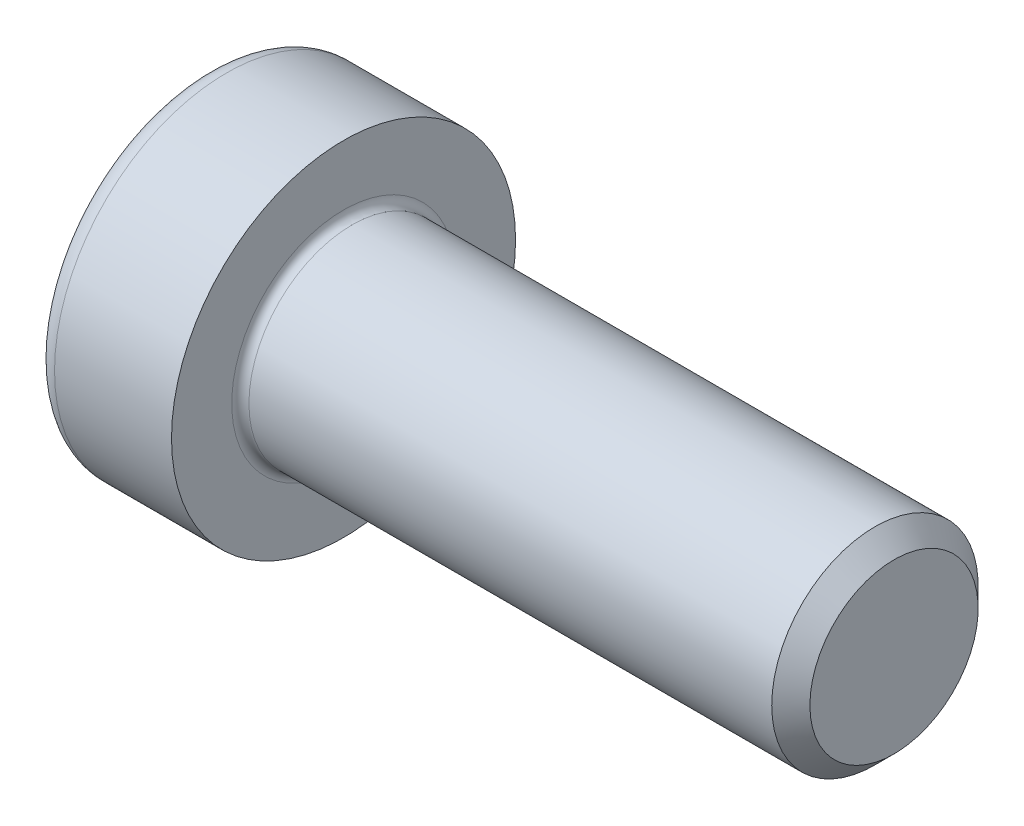
ISO-10303-21;
HEADER;
FILE_DESCRIPTION(('STEP AP214'),'2;1');
FILE_NAME('part.step','',(''),(''),'','','');
FILE_SCHEMA(('AUTOMOTIVE_DESIGN { 1 0 10303 214 1 1 1 1 }'));
ENDSEC;
DATA;
#1=APPLICATION_CONTEXT('core data for automotive mechanical design processes');
#2=APPLICATION_PROTOCOL_DEFINITION('international standard','automotive_design',2000,#1);
#3=PRODUCT_CONTEXT('',#1,'mechanical');
#4=PRODUCT('Part','Part','',(#3));
#5=PRODUCT_RELATED_PRODUCT_CATEGORY('part','',(#4));
#6=PRODUCT_DEFINITION_FORMATION('','',#4);
#7=PRODUCT_DEFINITION_CONTEXT('part definition',#1,'design');
#8=PRODUCT_DEFINITION('design','',#6,#7);
#9=PRODUCT_DEFINITION_SHAPE('','',#8);
#10=(LENGTH_UNIT() NAMED_UNIT(*) SI_UNIT(.MILLI.,.METRE.));
#11=(NAMED_UNIT(*) PLANE_ANGLE_UNIT() SI_UNIT($,.RADIAN.));
#12=(NAMED_UNIT(*) SI_UNIT($,.STERADIAN.) SOLID_ANGLE_UNIT());
#13=UNCERTAINTY_MEASURE_WITH_UNIT(LENGTH_MEASURE(1.E-05),#10,'distance_accuracy_value','');
#14=(GEOMETRIC_REPRESENTATION_CONTEXT(3) GLOBAL_UNCERTAINTY_ASSIGNED_CONTEXT((#13)) GLOBAL_UNIT_ASSIGNED_CONTEXT((#10,
#11,#12)) REPRESENTATION_CONTEXT('',''));
#15=CARTESIAN_POINT('',(0.,0.,0.));
#16=DIRECTION('',(0.,0.,1.));
#17=DIRECTION('',(1.,0.,0.));
#18=AXIS2_PLACEMENT_3D('',#15,#16,#17);
#19=CARTESIAN_POINT('',(2.5,1.44337567297408,2.49999999999999));
#20=DIRECTION('',(-1.,0.,0.));
#21=DIRECTION('',(0.,0.,1.));
#22=AXIS2_PLACEMENT_3D('',#19,#20,#21);
#23=PLANE('',#22);
#24=CARTESIAN_POINT('',(2.5,0.,0.));
#25=DIRECTION('',(-1.,0.,0.));
#26=DIRECTION('',(0.,0.,1.));
#27=AXIS2_PLACEMENT_3D('',#24,#25,#26);
#28=CIRCLE('',#27,2.5);
#29=CARTESIAN_POINT('',(2.5,0.,2.5));
#30=VERTEX_POINT('',#29);
#31=CARTESIAN_POINT('',(2.5,2.1650635094611,1.24999999999999));
#32=VERTEX_POINT('',#31);
#33=EDGE_CURVE('E120',#30,#32,#28,.T.);
#34=ORIENTED_EDGE('',*,*,#33,.F.);
#35=DIRECTION('',(0.,1.,0.));
#36=VECTOR('',#35,1.);
#37=CARTESIAN_POINT('',(2.5,-1.44337567297405,2.5));
#38=LINE('',#37,#36);
#39=CARTESIAN_POINT('',(2.5,1.44337567297408,2.49999999999999));
#40=VERTEX_POINT('',#39);
#41=EDGE_CURVE('E127',#30,#40,#38,.T.);
#42=ORIENTED_EDGE('',*,*,#41,.T.);
#43=DIRECTION('',(0.,-0.499999999999997,0.86602540378444));
#44=VECTOR('',#43,1.);
#45=CARTESIAN_POINT('',(2.5,2.88675134594813,0.));
#46=LINE('',#45,#44);
#47=EDGE_CURVE('E128',#32,#40,#46,.T.);
#48=ORIENTED_EDGE('',*,*,#47,.F.);
#49=EDGE_LOOP('',(#34,#42,#48));
#50=FACE_BOUND('',#49,.T.);
#51=ADVANCED_FACE('F36',(#50),#23,.T.);
#52=CARTESIAN_POINT('',(2.5,0.,0.));
#53=DIRECTION('',(-1.,0.,0.));
#54=DIRECTION('',(0.,0.,1.));
#55=AXIS2_PLACEMENT_3D('',#52,#53,#54);
#56=CIRCLE('',#55,2.5);
#57=CARTESIAN_POINT('',(2.5,2.1650635094611,-1.25));
#58=VERTEX_POINT('',#57);
#59=EDGE_CURVE('E11',#32,#58,#56,.T.);
#60=ORIENTED_EDGE('',*,*,#59,.F.);
#61=CARTESIAN_POINT('',(2.5,2.88675134594813,0.));
#62=VERTEX_POINT('',#61);
#63=EDGE_CURVE('E124',#62,#32,#46,.T.);
#64=ORIENTED_EDGE('',*,*,#63,.F.);
#65=DIRECTION('',(0.,-0.500000000000001,-0.866025403784438));
#66=VECTOR('',#65,1.);
#67=CARTESIAN_POINT('',(2.5,2.88675134594813,0.));
#68=LINE('',#67,#66);
#69=EDGE_CURVE('E145',#62,#58,#68,.T.);
#70=ORIENTED_EDGE('',*,*,#69,.T.);
#71=EDGE_LOOP('',(#60,#64,#70));
#72=FACE_BOUND('',#71,.T.);
#73=ADVANCED_FACE('F249',(#72),#23,.T.);
#74=CARTESIAN_POINT('',(2.5,0.,-2.5));
#75=VERTEX_POINT('',#74);
#76=EDGE_CURVE('E45',#58,#75,#56,.T.);
#77=ORIENTED_EDGE('',*,*,#76,.F.);
#78=CARTESIAN_POINT('',(2.5,1.44337567297407,-2.50000000000001));
#79=VERTEX_POINT('',#78);
#80=EDGE_CURVE('E144',#58,#79,#68,.T.);
#81=ORIENTED_EDGE('',*,*,#80,.T.);
#82=DIRECTION('',(0.,-1.,0.));
#83=VECTOR('',#82,1.);
#84=CARTESIAN_POINT('',(2.5,1.44337567297407,-2.50000000000001));
#85=LINE('',#84,#83);
#86=EDGE_CURVE('E141',#79,#75,#85,.T.);
#87=ORIENTED_EDGE('',*,*,#86,.T.);
#88=EDGE_LOOP('',(#77,#81,#87));
#89=FACE_BOUND('',#88,.T.);
#90=ADVANCED_FACE('F214',(#89),#23,.T.);
#91=CARTESIAN_POINT('',(2.5,-2.1650635094611,-1.24999999999999));
#92=VERTEX_POINT('',#91);
#93=EDGE_CURVE('E198',#75,#92,#56,.T.);
#94=ORIENTED_EDGE('',*,*,#93,.F.);
#95=CARTESIAN_POINT('',(2.5,-1.44337567297406,-2.5));
#96=VERTEX_POINT('',#95);
#97=EDGE_CURVE('E140',#75,#96,#85,.T.);
#98=ORIENTED_EDGE('',*,*,#97,.T.);
#99=DIRECTION('',(0.,0.499999999999998,-0.86602540378444));
#100=VECTOR('',#99,1.);
#101=CARTESIAN_POINT('',(2.5,-2.88675134594812,0.));
#102=LINE('',#101,#100);
#103=EDGE_CURVE('E136',#92,#96,#102,.T.);
#104=ORIENTED_EDGE('',*,*,#103,.F.);
#105=EDGE_LOOP('',(#94,#98,#104));
#106=FACE_BOUND('',#105,.T.);
#107=ADVANCED_FACE('F209',(#106),#23,.T.);
#108=CARTESIAN_POINT('',(2.5,-2.16506350946109,1.25));
#109=VERTEX_POINT('',#108);
#110=EDGE_CURVE('E52',#92,#109,#56,.T.);
#111=ORIENTED_EDGE('',*,*,#110,.F.);
#112=CARTESIAN_POINT('',(2.5,-2.88675134594812,0.));
#113=VERTEX_POINT('',#112);
#114=EDGE_CURVE('E137',#113,#92,#102,.T.);
#115=ORIENTED_EDGE('',*,*,#114,.F.);
#116=DIRECTION('',(0.,-0.500000000000001,-0.866025403784438));
#117=VECTOR('',#116,1.);
#118=CARTESIAN_POINT('',(2.5,-1.44337567297405,2.5));
#119=LINE('',#118,#117);
#120=EDGE_CURVE('E132',#109,#113,#119,.T.);
#121=ORIENTED_EDGE('',*,*,#120,.F.);
#122=EDGE_LOOP('',(#111,#115,#121));
#123=FACE_BOUND('',#122,.T.);
#124=ADVANCED_FACE('F232',(#123),#23,.T.);
#125=CARTESIAN_POINT('',(0.,0.,0.));
#126=DIRECTION('',(-1.,0.,0.));
#127=DIRECTION('',(0.,0.,1.));
#128=AXIS2_PLACEMENT_3D('',#125,#126,#127);
#129=PLANE('',#128);
#130=CARTESIAN_POINT('',(0.,0.,0.));
#131=DIRECTION('',(-1.,0.,0.));
#132=DIRECTION('',(0.,0.,1.));
#133=AXIS2_PLACEMENT_3D('',#130,#131,#132);
#134=CIRCLE('',#133,4.4);
#135=CARTESIAN_POINT('',(0.,0.,4.4));
#136=VERTEX_POINT('',#135);
#137=EDGE_CURVE('E191',#136,#136,#134,.T.);
#138=ORIENTED_EDGE('',*,*,#137,.T.);
#139=EDGE_LOOP('',(#138));
#140=FACE_BOUND('',#139,.T.);
#141=DIRECTION('',(0.,-0.500000000000001,-0.866025403784438));
#142=VECTOR('',#141,1.);
#143=CARTESIAN_POINT('',(0.,2.88675134594813,0.));
#144=LINE('',#143,#142);
#145=CARTESIAN_POINT('',(0.,2.88675134594813,0.));
#146=VERTEX_POINT('',#145);
#147=CARTESIAN_POINT('',(0.,1.44337567297407,-2.50000000000001));
#148=VERTEX_POINT('',#147);
#149=EDGE_CURVE('E160',#146,#148,#144,.T.);
#150=ORIENTED_EDGE('',*,*,#149,.F.);
#151=DIRECTION('',(0.,-0.499999999999997,0.86602540378444));
#152=VECTOR('',#151,1.);
#153=CARTESIAN_POINT('',(0.,2.88675134594813,0.));
#154=LINE('',#153,#152);
#155=CARTESIAN_POINT('',(0.,1.44337567297408,2.49999999999999));
#156=VERTEX_POINT('',#155);
#157=EDGE_CURVE('E60',#146,#156,#154,.T.);
#158=ORIENTED_EDGE('',*,*,#157,.T.);
#159=DIRECTION('',(0.,1.,0.));
#160=VECTOR('',#159,1.);
#161=CARTESIAN_POINT('',(0.,-1.44337567297405,2.5));
#162=LINE('',#161,#160);
#163=CARTESIAN_POINT('',(0.,-1.44337567297405,2.5));
#164=VERTEX_POINT('',#163);
#165=EDGE_CURVE('E150',#164,#156,#162,.T.);
#166=ORIENTED_EDGE('',*,*,#165,.F.);
#167=DIRECTION('',(0.,-0.500000000000001,-0.866025403784438));
#168=VECTOR('',#167,1.);
#169=CARTESIAN_POINT('',(0.,-1.44337567297405,2.5));
#170=LINE('',#169,#168);
#171=CARTESIAN_POINT('',(0.,-2.88675134594812,0.));
#172=VERTEX_POINT('',#171);
#173=EDGE_CURVE('E153',#164,#172,#170,.T.);
#174=ORIENTED_EDGE('',*,*,#173,.T.);
#175=DIRECTION('',(0.,0.499999999999998,-0.86602540378444));
#176=VECTOR('',#175,1.);
#177=CARTESIAN_POINT('',(0.,-2.88675134594812,0.));
#178=LINE('',#177,#176);
#179=CARTESIAN_POINT('',(0.,-1.44337567297406,-2.5));
#180=VERTEX_POINT('',#179);
#181=EDGE_CURVE('E155',#172,#180,#178,.T.);
#182=ORIENTED_EDGE('',*,*,#181,.T.);
#183=DIRECTION('',(0.,-1.,0.));
#184=VECTOR('',#183,1.);
#185=CARTESIAN_POINT('',(0.,1.44337567297407,-2.50000000000001));
#186=LINE('',#185,#184);
#187=EDGE_CURVE('E157',#148,#180,#186,.T.);
#188=ORIENTED_EDGE('',*,*,#187,.F.);
#189=EDGE_LOOP('',(#150,#158,#166,#174,#182,#188));
#190=FACE_BOUND('',#189,.T.);
#191=ADVANCED_FACE('F222',(#140,#190),#129,.T.);
#192=CARTESIAN_POINT('',(-31.75,0.,0.));
#193=DIRECTION('',(-1.,0.,0.));
#194=DIRECTION('',(0.,0.,1.));
#195=AXIS2_PLACEMENT_3D('',#192,#193,#194);
#196=CYLINDRICAL_SURFACE('',#195,5.);
#197=CARTESIAN_POINT('',(0.600000000000003,0.,0.));
#198=DIRECTION('',(-1.,0.,0.));
#199=DIRECTION('',(0.,0.,1.));
#200=AXIS2_PLACEMENT_3D('',#197,#198,#199);
#201=CIRCLE('',#200,5.);
#202=CARTESIAN_POINT('',(0.600000000000003,0.,5.));
#203=VERTEX_POINT('',#202);
#204=EDGE_CURVE('E193',#203,#203,#201,.F.);
#205=ORIENTED_EDGE('',*,*,#204,.T.);
#206=EDGE_LOOP('',(#205));
#207=FACE_BOUND('',#206,.T.);
#208=CARTESIAN_POINT('',(4.,0.,0.));
#209=DIRECTION('',(-1.,0.,0.));
#210=DIRECTION('',(0.,0.,1.));
#211=AXIS2_PLACEMENT_3D('',#208,#209,#210);
#212=CIRCLE('',#211,5.);
#213=CARTESIAN_POINT('',(4.,0.,5.));
#214=VERTEX_POINT('',#213);
#215=EDGE_CURVE('E182',#214,#214,#212,.T.);
#216=ORIENTED_EDGE('',*,*,#215,.T.);
#217=EDGE_LOOP('',(#216));
#218=FACE_BOUND('',#217,.T.);
#219=ADVANCED_FACE('F288',(#207,#218),#196,.T.);
#220=CARTESIAN_POINT('',(4.,5.,0.));
#221=DIRECTION('',(1.,0.,0.));
#222=DIRECTION('',(0.,0.,-1.));
#223=AXIS2_PLACEMENT_3D('',#220,#221,#222);
#224=PLANE('',#223);
#225=CARTESIAN_POINT('',(4.,0.,0.));
#226=DIRECTION('',(1.,0.,0.));
#227=DIRECTION('',(0.,0.,-1.));
#228=AXIS2_PLACEMENT_3D('',#225,#226,#227);
#229=CIRCLE('',#228,3.24999999999999);
#230=CARTESIAN_POINT('',(4.,0.,-3.24999999999999));
#231=VERTEX_POINT('',#230);
#232=EDGE_CURVE('E185',#231,#231,#229,.F.);
#233=ORIENTED_EDGE('',*,*,#232,.T.);
#234=EDGE_LOOP('',(#233));
#235=FACE_BOUND('',#234,.T.);
#236=ORIENTED_EDGE('',*,*,#215,.F.);
#237=EDGE_LOOP('',(#236));
#238=FACE_BOUND('',#237,.T.);
#239=ADVANCED_FACE('F284',(#235,#238),#224,.T.);
#240=CARTESIAN_POINT('',(-31.75,0.,0.));
#241=DIRECTION('',(-1.,0.,0.));
#242=DIRECTION('',(0.,0.,1.));
#243=AXIS2_PLACEMENT_3D('',#240,#241,#242);
#244=CYLINDRICAL_SURFACE('',#243,2.99999999999999);
#245=CARTESIAN_POINT('',(4.25,0.,0.));
#246=DIRECTION('',(1.,0.,0.));
#247=DIRECTION('',(0.,0.,-1.));
#248=AXIS2_PLACEMENT_3D('',#245,#246,#247);
#249=CIRCLE('',#248,2.99999999999999);
#250=CARTESIAN_POINT('',(4.25,0.,-2.99999999999999));
#251=VERTEX_POINT('',#250);
#252=EDGE_CURVE('E188',#251,#251,#249,.T.);
#253=ORIENTED_EDGE('',*,*,#252,.T.);
#254=EDGE_LOOP('',(#253));
#255=FACE_BOUND('',#254,.T.);
#256=CARTESIAN_POINT('',(19.4455,0.,0.));
#257=DIRECTION('',(-1.,0.,0.));
#258=DIRECTION('',(0.,0.,1.));
#259=AXIS2_PLACEMENT_3D('',#256,#257,#258);
#260=CIRCLE('',#259,2.99999999999998);
#261=CARTESIAN_POINT('',(19.4455,0.,2.99999999999998));
#262=VERTEX_POINT('',#261);
#263=EDGE_CURVE('E179',#262,#262,#260,.T.);
#264=ORIENTED_EDGE('',*,*,#263,.T.);
#265=EDGE_LOOP('',(#264));
#266=FACE_BOUND('',#265,.T.);
#267=ADVANCED_FACE('F280',(#255,#266),#244,.T.);
#268=CARTESIAN_POINT('',(20.,0.,0.));
#269=DIRECTION('',(-1.,0.,0.));
#270=DIRECTION('',(0.,0.,1.));
#271=AXIS2_PLACEMENT_3D('',#268,#269,#270);
#272=CONICAL_SURFACE('',#271,2.4455,0.785398163397407);
#273=ORIENTED_EDGE('',*,*,#263,.F.);
#274=EDGE_LOOP('',(#273));
#275=FACE_BOUND('',#274,.T.);
#276=CARTESIAN_POINT('',(20.,0.,0.));
#277=DIRECTION('',(-1.,0.,0.));
#278=DIRECTION('',(0.,0.,1.));
#279=AXIS2_PLACEMENT_3D('',#276,#277,#278);
#280=CIRCLE('',#279,2.4455);
#281=CARTESIAN_POINT('',(20.,0.,2.4455));
#282=VERTEX_POINT('',#281);
#283=EDGE_CURVE('E176',#282,#282,#280,.T.);
#284=ORIENTED_EDGE('',*,*,#283,.T.);
#285=EDGE_LOOP('',(#284));
#286=FACE_BOUND('',#285,.T.);
#287=ADVANCED_FACE('F276',(#275,#286),#272,.T.);
#288=CARTESIAN_POINT('',(20.,2.4455,0.));
#289=DIRECTION('',(1.,0.,0.));
#290=DIRECTION('',(0.,0.,-1.));
#291=AXIS2_PLACEMENT_3D('',#288,#289,#290);
#292=PLANE('',#291);
#293=ORIENTED_EDGE('',*,*,#283,.F.);
#294=EDGE_LOOP('',(#293));
#295=FACE_BOUND('',#294,.T.);
#296=ADVANCED_FACE('F272',(#295),#292,.T.);
#297=CARTESIAN_POINT('',(4.25,0.,0.));
#298=DIRECTION('',(1.,0.,0.));
#299=DIRECTION('',(0.,0.,-1.));
#300=AXIS2_PLACEMENT_3D('',#297,#298,#299);
#301=TOROIDAL_SURFACE('',#300,3.24999999999999,0.25);
#302=ORIENTED_EDGE('',*,*,#252,.F.);
#303=EDGE_LOOP('',(#302));
#304=FACE_BOUND('',#303,.T.);
#305=ORIENTED_EDGE('',*,*,#232,.F.);
#306=EDGE_LOOP('',(#305));
#307=FACE_BOUND('',#306,.T.);
#308=ADVANCED_FACE('F275',(#304,#307),#301,.F.);
#309=CARTESIAN_POINT('',(0.600000000000003,0.,0.));
#310=DIRECTION('',(-1.,0.,0.));
#311=DIRECTION('',(0.,0.,1.));
#312=AXIS2_PLACEMENT_3D('',#309,#310,#311);
#313=TOROIDAL_SURFACE('',#312,4.4,0.6);
#314=ORIENTED_EDGE('',*,*,#204,.F.);
#315=EDGE_LOOP('',(#314));
#316=FACE_BOUND('',#315,.T.);
#317=ORIENTED_EDGE('',*,*,#137,.F.);
#318=EDGE_LOOP('',(#317));
#319=FACE_BOUND('',#318,.T.);
#320=ADVANCED_FACE('F38',(#316,#319),#313,.T.);
#321=CARTESIAN_POINT('',(2.5,2.88675134594813,0.));
#322=DIRECTION('',(0.,-0.86602540378444,-0.499999999999997));
#323=DIRECTION('',(0.,0.499999999999998,-0.86602540378444));
#324=AXIS2_PLACEMENT_3D('',#321,#322,#323);
#325=PLANE('',#324);
#326=DIRECTION('',(-1.,0.,0.));
#327=VECTOR('',#326,1.);
#328=CARTESIAN_POINT('',(2.5,1.44337567297408,2.49999999999999));
#329=LINE('',#328,#327);
#330=EDGE_CURVE('E174',#40,#156,#329,.T.);
#331=ORIENTED_EDGE('',*,*,#330,.T.);
#332=ORIENTED_EDGE('',*,*,#157,.F.);
#333=DIRECTION('',(-1.,0.,0.));
#334=VECTOR('',#333,1.);
#335=CARTESIAN_POINT('',(2.5,2.88675134594813,0.));
#336=LINE('',#335,#334);
#337=EDGE_CURVE('E148',#62,#146,#336,.T.);
#338=ORIENTED_EDGE('',*,*,#337,.F.);
#339=ORIENTED_EDGE('',*,*,#63,.T.);
#340=ORIENTED_EDGE('',*,*,#47,.T.);
#341=EDGE_LOOP('',(#331,#332,#338,#339,#340));
#342=FACE_BOUND('',#341,.T.);
#343=ADVANCED_FACE('F246',(#342),#325,.T.);
#344=CARTESIAN_POINT('',(2.5,-1.44337567297405,2.5));
#345=DIRECTION('',(0.,0.,1.));
#346=DIRECTION('',(0.,-1.,0.));
#347=AXIS2_PLACEMENT_3D('',#344,#345,#346);
#348=PLANE('',#347);
#349=ORIENTED_EDGE('',*,*,#41,.F.);
#350=CARTESIAN_POINT('',(2.5,-1.44337567297405,2.5));
#351=VERTEX_POINT('',#350);
#352=EDGE_CURVE('E129',#351,#30,#38,.T.);
#353=ORIENTED_EDGE('',*,*,#352,.F.);
#354=DIRECTION('',(-1.,0.,0.));
#355=VECTOR('',#354,1.);
#356=CARTESIAN_POINT('',(2.5,-1.44337567297405,2.5));
#357=LINE('',#356,#355);
#358=EDGE_CURVE('E172',#351,#164,#357,.T.);
#359=ORIENTED_EDGE('',*,*,#358,.T.);
#360=ORIENTED_EDGE('',*,*,#165,.T.);
#361=ORIENTED_EDGE('',*,*,#330,.F.);
#362=EDGE_LOOP('',(#349,#353,#359,#360,#361));
#363=FACE_BOUND('',#362,.T.);
#364=ADVANCED_FACE('F241',(#363),#348,.F.);
#365=CARTESIAN_POINT('',(2.5,-1.44337567297405,2.5));
#366=DIRECTION('',(0.,0.866025403784438,-0.500000000000001));
#367=DIRECTION('',(0.,0.500000000000001,0.866025403784438));
#368=AXIS2_PLACEMENT_3D('',#365,#366,#367);
#369=PLANE('',#368);
#370=DIRECTION('',(-1.,0.,0.));
#371=VECTOR('',#370,1.);
#372=CARTESIAN_POINT('',(2.5,-2.88675134594812,0.));
#373=LINE('',#372,#371);
#374=EDGE_CURVE('E169',#113,#172,#373,.T.);
#375=ORIENTED_EDGE('',*,*,#374,.T.);
#376=ORIENTED_EDGE('',*,*,#173,.F.);
#377=ORIENTED_EDGE('',*,*,#358,.F.);
#378=EDGE_CURVE('E133',#351,#109,#119,.T.);
#379=ORIENTED_EDGE('',*,*,#378,.T.);
#380=ORIENTED_EDGE('',*,*,#120,.T.);
#381=EDGE_LOOP('',(#375,#376,#377,#379,#380));
#382=FACE_BOUND('',#381,.T.);
#383=ADVANCED_FACE('F235',(#382),#369,.T.);
#384=CARTESIAN_POINT('',(2.5,-2.88675134594812,0.));
#385=DIRECTION('',(0.,0.86602540378444,0.499999999999998));
#386=DIRECTION('',(0.,-0.499999999999998,0.86602540378444));
#387=AXIS2_PLACEMENT_3D('',#384,#385,#386);
#388=PLANE('',#387);
#389=DIRECTION('',(-1.,0.,0.));
#390=VECTOR('',#389,1.);
#391=CARTESIAN_POINT('',(2.5,-1.44337567297406,-2.5));
#392=LINE('',#391,#390);
#393=EDGE_CURVE('E166',#96,#180,#392,.T.);
#394=ORIENTED_EDGE('',*,*,#393,.T.);
#395=ORIENTED_EDGE('',*,*,#181,.F.);
#396=ORIENTED_EDGE('',*,*,#374,.F.);
#397=ORIENTED_EDGE('',*,*,#114,.T.);
#398=ORIENTED_EDGE('',*,*,#103,.T.);
#399=EDGE_LOOP('',(#394,#395,#396,#397,#398));
#400=FACE_BOUND('',#399,.T.);
#401=ADVANCED_FACE('F228',(#400),#388,.T.);
#402=CARTESIAN_POINT('',(2.5,1.44337567297407,-2.50000000000001));
#403=DIRECTION('',(0.,0.,-1.));
#404=DIRECTION('',(0.,1.,0.));
#405=AXIS2_PLACEMENT_3D('',#402,#403,#404);
#406=PLANE('',#405);
#407=ORIENTED_EDGE('',*,*,#97,.F.);
#408=ORIENTED_EDGE('',*,*,#86,.F.);
#409=DIRECTION('',(-1.,0.,0.));
#410=VECTOR('',#409,1.);
#411=CARTESIAN_POINT('',(2.5,1.44337567297407,-2.50000000000001));
#412=LINE('',#411,#410);
#413=EDGE_CURVE('E163',#79,#148,#412,.T.);
#414=ORIENTED_EDGE('',*,*,#413,.T.);
#415=ORIENTED_EDGE('',*,*,#187,.T.);
#416=ORIENTED_EDGE('',*,*,#393,.F.);
#417=EDGE_LOOP('',(#407,#408,#414,#415,#416));
#418=FACE_BOUND('',#417,.T.);
#419=ADVANCED_FACE('F213',(#418),#406,.F.);
#420=CARTESIAN_POINT('',(2.5,2.88675134594813,0.));
#421=DIRECTION('',(0.,0.866025403784438,-0.500000000000001));
#422=DIRECTION('',(0.,0.500000000000001,0.866025403784438));
#423=AXIS2_PLACEMENT_3D('',#420,#421,#422);
#424=PLANE('',#423);
#425=ORIENTED_EDGE('',*,*,#80,.F.);
#426=ORIENTED_EDGE('',*,*,#69,.F.);
#427=ORIENTED_EDGE('',*,*,#337,.T.);
#428=ORIENTED_EDGE('',*,*,#149,.T.);
#429=ORIENTED_EDGE('',*,*,#413,.F.);
#430=EDGE_LOOP('',(#425,#426,#427,#428,#429));
#431=FACE_BOUND('',#430,.T.);
#432=ADVANCED_FACE('F218',(#431),#424,.F.);
#433=EDGE_CURVE('E40',#109,#30,#56,.T.);
#434=ORIENTED_EDGE('',*,*,#433,.F.);
#435=ORIENTED_EDGE('',*,*,#378,.F.);
#436=ORIENTED_EDGE('',*,*,#352,.T.);
#437=EDGE_LOOP('',(#434,#435,#436));
#438=FACE_BOUND('',#437,.T.);
#439=ADVANCED_FACE('F238',(#438),#23,.T.);
#440=CARTESIAN_POINT('',(2.5,0.,0.));
#441=DIRECTION('',(-1.,0.,0.));
#442=DIRECTION('',(0.,0.,1.));
#443=AXIS2_PLACEMENT_3D('',#440,#441,#442);
#444=CONICAL_SURFACE('',#443,2.5,1.04719755119659);
#445=CARTESIAN_POINT('',(3.07735026918963,0.,0.));
#446=DIRECTION('',(-1.,0.,0.));
#447=DIRECTION('',(0.,0.,1.));
#448=AXIS2_PLACEMENT_3D('',#445,#446,#447);
#449=CIRCLE('',#448,1.5);
#450=CARTESIAN_POINT('',(3.07735026918963,0.,1.5));
#451=VERTEX_POINT('',#450);
#452=EDGE_CURVE('E117',#451,#451,#449,.T.);
#453=ORIENTED_EDGE('',*,*,#452,.F.);
#454=EDGE_LOOP('',(#453));
#455=FACE_BOUND('',#454,.T.);
#456=ORIENTED_EDGE('',*,*,#33,.T.);
#457=ORIENTED_EDGE('',*,*,#59,.T.);
#458=ORIENTED_EDGE('',*,*,#76,.T.);
#459=ORIENTED_EDGE('',*,*,#93,.T.);
#460=ORIENTED_EDGE('',*,*,#110,.T.);
#461=ORIENTED_EDGE('',*,*,#433,.T.);
#462=EDGE_LOOP('',(#456,#457,#458,#459,#460,#461));
#463=FACE_BOUND('',#462,.T.);
#464=ADVANCED_FACE('F201',(#455,#463),#444,.F.);
#465=CARTESIAN_POINT('',(0.,0.,0.));
#466=DIRECTION('',(-1.,0.,0.));
#467=DIRECTION('',(0.,0.,1.));
#468=AXIS2_PLACEMENT_3D('',#465,#466,#467);
#469=CYLINDRICAL_SURFACE('',#468,1.5);
#470=CARTESIAN_POINT('',(5.,0.,0.));
#471=DIRECTION('',(-1.,0.,0.));
#472=DIRECTION('',(0.,0.,1.));
#473=AXIS2_PLACEMENT_3D('',#470,#471,#472);
#474=CIRCLE('',#473,1.5);
#475=CARTESIAN_POINT('',(5.,0.,1.5));
#476=VERTEX_POINT('',#475);
#477=EDGE_CURVE('E115',#476,#476,#474,.T.);
#478=ORIENTED_EDGE('',*,*,#477,.F.);
#479=EDGE_LOOP('',(#478));
#480=FACE_BOUND('',#479,.T.);
#481=ORIENTED_EDGE('',*,*,#452,.T.);
#482=EDGE_LOOP('',(#481));
#483=FACE_BOUND('',#482,.T.);
#484=ADVANCED_FACE('F111',(#480,#483),#469,.F.);
#485=CARTESIAN_POINT('',(5.,0.,0.));
#486=DIRECTION('',(-1.,0.,0.));
#487=DIRECTION('',(0.,0.,1.));
#488=AXIS2_PLACEMENT_3D('',#485,#486,#487);
#489=CONICAL_SURFACE('',#488,1.5,1.04719755119659);
#490=CARTESIAN_POINT('',(5.86602540378445,0.,0.));
#491=VERTEX_POINT('',#490);
#492=VERTEX_LOOP('',#491);
#493=FACE_BOUND('',#492,.T.);
#494=ORIENTED_EDGE('',*,*,#477,.T.);
#495=EDGE_LOOP('',(#494));
#496=FACE_BOUND('',#495,.T.);
#497=ADVANCED_FACE('F108',(#493,#496),#489,.F.);
#498=CLOSED_SHELL('',(#51,#73,#90,#107,#124,#191,#219,#239,#267,#287,#296,#308,#320,#343,#364,
#383,#401,#419,#432,#439,#464,#484,#497));
#499=MANIFOLD_SOLID_BREP('B2',#498);
#500=ADVANCED_BREP_SHAPE_REPRESENTATION('',(#18,#499),#14);
#501=SHAPE_DEFINITION_REPRESENTATION(#9,#500);
ENDSEC;
END-ISO-10303-21;
